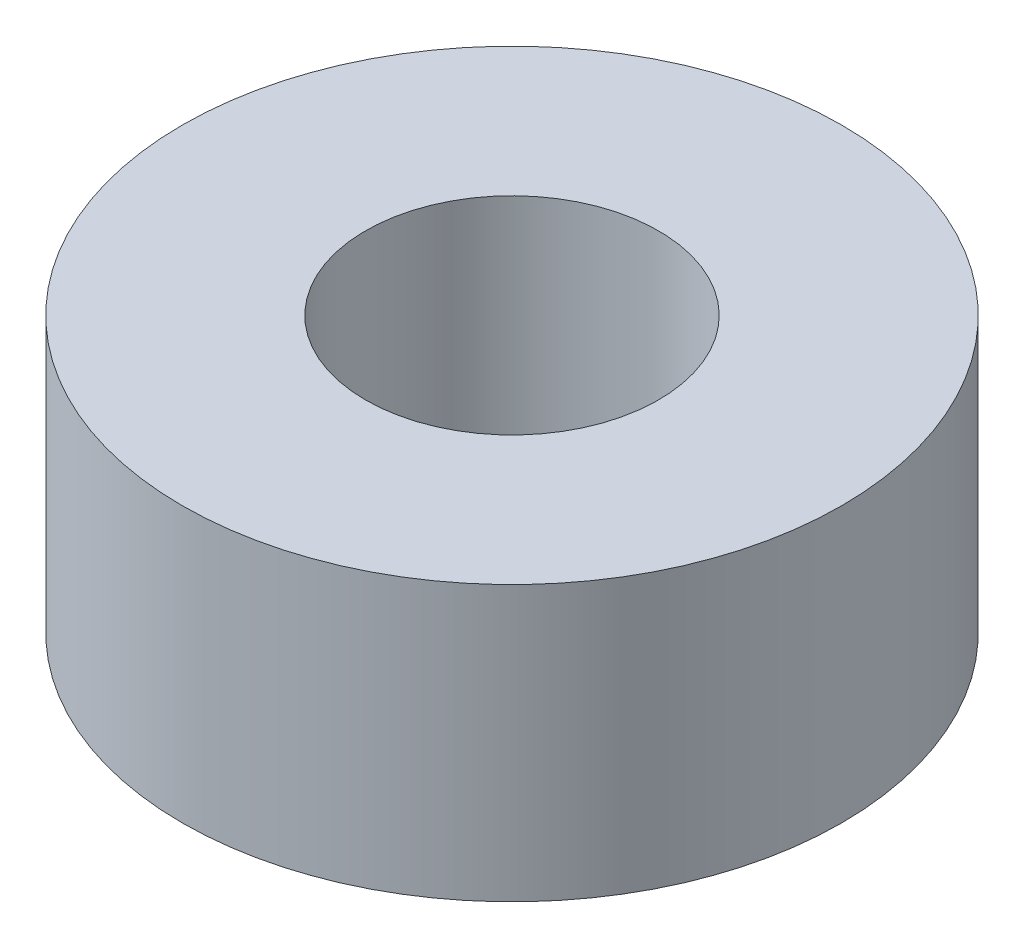
ISO-10303-21;
HEADER;
FILE_DESCRIPTION(('STEP AP214'),'2;1');
FILE_NAME('part.step','',(''),(''),'','','');
FILE_SCHEMA(('AUTOMOTIVE_DESIGN { 1 0 10303 214 1 1 1 1 }'));
ENDSEC;
DATA;
#1=APPLICATION_CONTEXT('core data for automotive mechanical design processes');
#2=APPLICATION_PROTOCOL_DEFINITION('international standard','automotive_design',2000,#1);
#3=PRODUCT_CONTEXT('',#1,'mechanical');
#4=PRODUCT('Part','Part','',(#3));
#5=PRODUCT_RELATED_PRODUCT_CATEGORY('part','',(#4));
#6=PRODUCT_DEFINITION_FORMATION('','',#4);
#7=PRODUCT_DEFINITION_CONTEXT('part definition',#1,'design');
#8=PRODUCT_DEFINITION('design','',#6,#7);
#9=PRODUCT_DEFINITION_SHAPE('','',#8);
#10=(LENGTH_UNIT() NAMED_UNIT(*) SI_UNIT(.MILLI.,.METRE.));
#11=(NAMED_UNIT(*) PLANE_ANGLE_UNIT() SI_UNIT($,.RADIAN.));
#12=(NAMED_UNIT(*) SI_UNIT($,.STERADIAN.) SOLID_ANGLE_UNIT());
#13=UNCERTAINTY_MEASURE_WITH_UNIT(LENGTH_MEASURE(1.E-05),#10,'distance_accuracy_value','');
#14=(GEOMETRIC_REPRESENTATION_CONTEXT(3) GLOBAL_UNCERTAINTY_ASSIGNED_CONTEXT((#13)) GLOBAL_UNIT_ASSIGNED_CONTEXT((#10,
#11,#12)) REPRESENTATION_CONTEXT('',''));
#15=CARTESIAN_POINT('',(0.,0.,0.));
#16=DIRECTION('',(0.,0.,1.));
#17=DIRECTION('',(1.,0.,0.));
#18=AXIS2_PLACEMENT_3D('',#15,#16,#17);
#19=CARTESIAN_POINT('',(0.,3.,0.));
#20=DIRECTION('',(0.,1.,0.));
#21=DIRECTION('',(0.,0.,1.));
#22=AXIS2_PLACEMENT_3D('',#19,#20,#21);
#23=PLANE('',#22);
#24=CARTESIAN_POINT('',(0.,3.,0.));
#25=DIRECTION('',(0.,1.,0.));
#26=DIRECTION('',(0.,0.,1.));
#27=AXIS2_PLACEMENT_3D('',#24,#25,#26);
#28=CIRCLE('',#27,3.6);
#29=CARTESIAN_POINT('',(0.,3.,3.6));
#30=VERTEX_POINT('',#29);
#31=EDGE_CURVE('E10',#30,#30,#28,.T.);
#32=ORIENTED_EDGE('',*,*,#31,.T.);
#33=EDGE_LOOP('',(#32));
#34=FACE_BOUND('',#33,.T.);
#35=CARTESIAN_POINT('',(0.,3.,0.));
#36=DIRECTION('',(0.,1.,0.));
#37=DIRECTION('',(0.,0.,1.));
#38=AXIS2_PLACEMENT_3D('',#35,#36,#37);
#39=CIRCLE('',#38,1.6);
#40=CARTESIAN_POINT('',(0.,3.,1.6));
#41=VERTEX_POINT('',#40);
#42=EDGE_CURVE('E42',#41,#41,#39,.T.);
#43=ORIENTED_EDGE('',*,*,#42,.F.);
#44=EDGE_LOOP('',(#43));
#45=FACE_BOUND('',#44,.T.);
#46=ADVANCED_FACE('F31',(#34,#45),#23,.T.);
#47=CARTESIAN_POINT('',(0.,0.,0.));
#48=DIRECTION('',(0.,1.,0.));
#49=DIRECTION('',(0.,0.,1.));
#50=AXIS2_PLACEMENT_3D('',#47,#48,#49);
#51=PLANE('',#50);
#52=CARTESIAN_POINT('',(0.,0.,0.));
#53=DIRECTION('',(0.,1.,0.));
#54=DIRECTION('',(0.,0.,1.));
#55=AXIS2_PLACEMENT_3D('',#52,#53,#54);
#56=CIRCLE('',#55,3.6);
#57=CARTESIAN_POINT('',(0.,0.,3.6));
#58=VERTEX_POINT('',#57);
#59=EDGE_CURVE('E35',#58,#58,#56,.T.);
#60=ORIENTED_EDGE('',*,*,#59,.F.);
#61=EDGE_LOOP('',(#60));
#62=FACE_BOUND('',#61,.T.);
#63=CARTESIAN_POINT('',(0.,0.,0.));
#64=DIRECTION('',(0.,1.,0.));
#65=DIRECTION('',(0.,0.,1.));
#66=AXIS2_PLACEMENT_3D('',#63,#64,#65);
#67=CIRCLE('',#66,1.6);
#68=CARTESIAN_POINT('',(0.,0.,1.6));
#69=VERTEX_POINT('',#68);
#70=EDGE_CURVE('E44',#69,#69,#67,.T.);
#71=ORIENTED_EDGE('',*,*,#70,.T.);
#72=EDGE_LOOP('',(#71));
#73=FACE_BOUND('',#72,.T.);
#74=ADVANCED_FACE('F54',(#62,#73),#51,.F.);
#75=CARTESIAN_POINT('',(0.,3.,0.));
#76=DIRECTION('',(0.,-1.,0.));
#77=DIRECTION('',(0.,0.,-1.));
#78=AXIS2_PLACEMENT_3D('',#75,#76,#77);
#79=CYLINDRICAL_SURFACE('',#78,3.6);
#80=ORIENTED_EDGE('',*,*,#31,.F.);
#81=EDGE_LOOP('',(#80));
#82=FACE_BOUND('',#81,.T.);
#83=ORIENTED_EDGE('',*,*,#59,.T.);
#84=EDGE_LOOP('',(#83));
#85=FACE_BOUND('',#84,.T.);
#86=ADVANCED_FACE('F33',(#82,#85),#79,.T.);
#87=CARTESIAN_POINT('',(0.,3.,0.));
#88=DIRECTION('',(0.,-1.,0.));
#89=DIRECTION('',(0.,0.,-1.));
#90=AXIS2_PLACEMENT_3D('',#87,#88,#89);
#91=CYLINDRICAL_SURFACE('',#90,1.6);
#92=ORIENTED_EDGE('',*,*,#42,.T.);
#93=EDGE_LOOP('',(#92));
#94=FACE_BOUND('',#93,.T.);
#95=ORIENTED_EDGE('',*,*,#70,.F.);
#96=EDGE_LOOP('',(#95));
#97=FACE_BOUND('',#96,.T.);
#98=ADVANCED_FACE('F50',(#94,#97),#91,.F.);
#99=CLOSED_SHELL('',(#46,#74,#86,#98));
#100=MANIFOLD_SOLID_BREP('B2',#99);
#101=ADVANCED_BREP_SHAPE_REPRESENTATION('',(#18,#100),#14);
#102=SHAPE_DEFINITION_REPRESENTATION(#9,#101);
ENDSEC;
END-ISO-10303-21;
